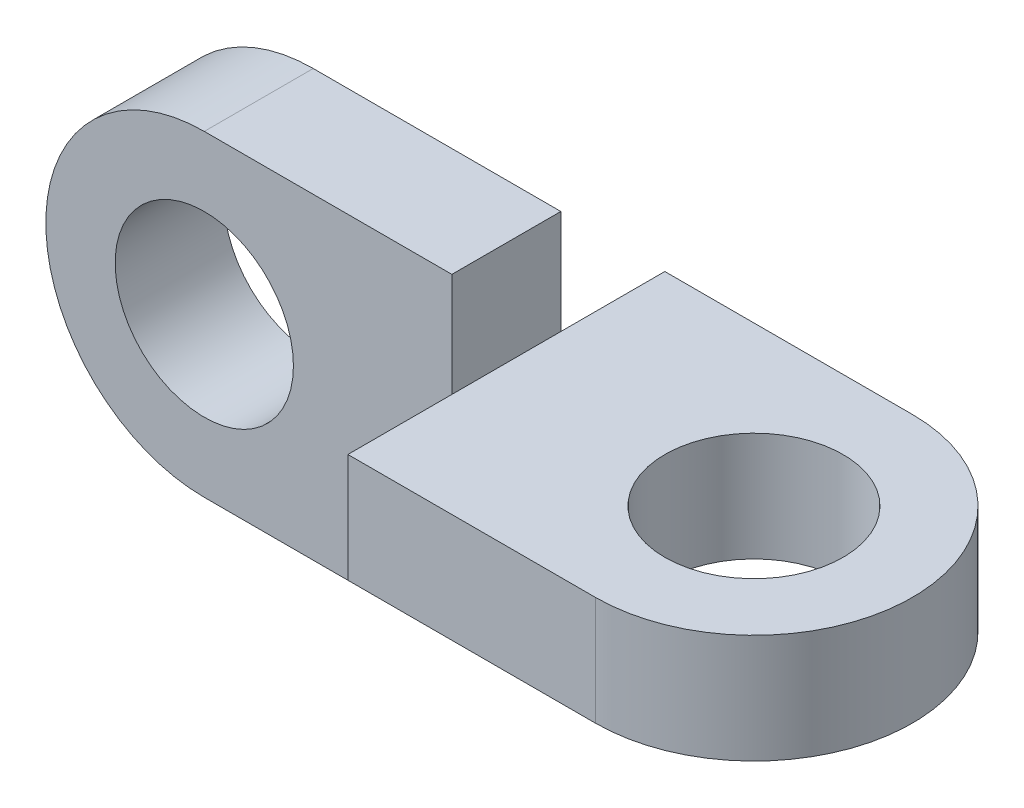
ISO-10303-21;
HEADER;
FILE_DESCRIPTION(('STEP AP214'),'2;1');
FILE_NAME('part.step','',(''),(''),'','','');
FILE_SCHEMA(('AUTOMOTIVE_DESIGN { 1 0 10303 214 1 1 1 1 }'));
ENDSEC;
DATA;
#1=APPLICATION_CONTEXT('core data for automotive mechanical design processes');
#2=APPLICATION_PROTOCOL_DEFINITION('international standard','automotive_design',2000,#1);
#3=PRODUCT_CONTEXT('',#1,'mechanical');
#4=PRODUCT('Part','Part','',(#3));
#5=PRODUCT_RELATED_PRODUCT_CATEGORY('part','',(#4));
#6=PRODUCT_DEFINITION_FORMATION('','',#4);
#7=PRODUCT_DEFINITION_CONTEXT('part definition',#1,'design');
#8=PRODUCT_DEFINITION('design','',#6,#7);
#9=PRODUCT_DEFINITION_SHAPE('','',#8);
#10=(LENGTH_UNIT() NAMED_UNIT(*) SI_UNIT(.MILLI.,.METRE.));
#11=(NAMED_UNIT(*) PLANE_ANGLE_UNIT() SI_UNIT($,.RADIAN.));
#12=(NAMED_UNIT(*) SI_UNIT($,.STERADIAN.) SOLID_ANGLE_UNIT());
#13=UNCERTAINTY_MEASURE_WITH_UNIT(LENGTH_MEASURE(1.E-05),#10,'distance_accuracy_value','');
#14=(GEOMETRIC_REPRESENTATION_CONTEXT(3) GLOBAL_UNCERTAINTY_ASSIGNED_CONTEXT((#13)) GLOBAL_UNIT_ASSIGNED_CONTEXT((#10,
#11,#12)) REPRESENTATION_CONTEXT('',''));
#15=CARTESIAN_POINT('',(0.,0.,0.));
#16=DIRECTION('',(0.,0.,1.));
#17=DIRECTION('',(1.,0.,0.));
#18=AXIS2_PLACEMENT_3D('',#15,#16,#17);
#19=CARTESIAN_POINT('',(50.,32.,11.));
#20=DIRECTION('',(-1.,0.,0.));
#21=DIRECTION('',(0.,0.,1.));
#22=AXIS2_PLACEMENT_3D('',#19,#20,#21);
#23=PLANE('',#22);
#24=DIRECTION('',(0.,0.,1.));
#25=VECTOR('',#24,1.);
#26=CARTESIAN_POINT('',(50.,11.,32.0000000000001));
#27=LINE('',#26,#25);
#28=CARTESIAN_POINT('',(50.,11.,-11.));
#29=VERTEX_POINT('',#28);
#30=CARTESIAN_POINT('',(50.,11.,11.));
#31=VERTEX_POINT('',#30);
#32=EDGE_CURVE('E48',#29,#31,#27,.T.);
#33=ORIENTED_EDGE('',*,*,#32,.F.);
#34=DIRECTION('',(0.,1.,0.));
#35=VECTOR('',#34,1.);
#36=CARTESIAN_POINT('',(50.,32.,-11.));
#37=LINE('',#36,#35);
#38=CARTESIAN_POINT('',(50.,32.,-11.));
#39=VERTEX_POINT('',#38);
#40=EDGE_CURVE('E176',#29,#39,#37,.T.);
#41=ORIENTED_EDGE('',*,*,#40,.T.);
#42=DIRECTION('',(0.,0.,-1.));
#43=VECTOR('',#42,1.);
#44=CARTESIAN_POINT('',(50.,32.,11.));
#45=LINE('',#44,#43);
#46=CARTESIAN_POINT('',(50.,32.,11.));
#47=VERTEX_POINT('',#46);
#48=EDGE_CURVE('E183',#47,#39,#45,.T.);
#49=ORIENTED_EDGE('',*,*,#48,.F.);
#50=DIRECTION('',(0.,1.,0.));
#51=VECTOR('',#50,1.);
#52=CARTESIAN_POINT('',(50.,32.,11.));
#53=LINE('',#52,#51);
#54=EDGE_CURVE('E164',#31,#47,#53,.T.);
#55=ORIENTED_EDGE('',*,*,#54,.F.);
#56=EDGE_LOOP('',(#33,#41,#49,#55));
#57=FACE_BOUND('',#56,.T.);
#58=ADVANCED_FACE('F39',(#57),#23,.F.);
#59=CARTESIAN_POINT('',(0.,0.,11.));
#60=DIRECTION('',(0.,0.,1.));
#61=DIRECTION('',(1.,0.,0.));
#62=AXIS2_PLACEMENT_3D('',#59,#60,#61);
#63=PLANE('',#62);
#64=CARTESIAN_POINT('',(0.,0.,11.));
#65=DIRECTION('',(0.,0.,1.));
#66=DIRECTION('',(1.,0.,0.));
#67=AXIS2_PLACEMENT_3D('',#64,#65,#66);
#68=CIRCLE('',#67,32.);
#69=CARTESIAN_POINT('',(0.,32.,11.));
#70=VERTEX_POINT('',#69);
#71=CARTESIAN_POINT('',(0.,-32.,11.));
#72=VERTEX_POINT('',#71);
#73=EDGE_CURVE('E159',#70,#72,#68,.T.);
#74=ORIENTED_EDGE('',*,*,#73,.T.);
#75=DIRECTION('',(1.,0.,0.));
#76=VECTOR('',#75,1.);
#77=CARTESIAN_POINT('',(50.,-32.,11.));
#78=LINE('',#77,#76);
#79=CARTESIAN_POINT('',(50.,-32.,11.));
#80=VERTEX_POINT('',#79);
#81=EDGE_CURVE('E165',#72,#80,#78,.T.);
#82=ORIENTED_EDGE('',*,*,#81,.T.);
#83=CARTESIAN_POINT('',(50.,-11.,11.));
#84=VERTEX_POINT('',#83);
#85=EDGE_CURVE('E168',#80,#84,#53,.T.);
#86=ORIENTED_EDGE('',*,*,#85,.T.);
#87=EDGE_CURVE('E170',#84,#31,#53,.T.);
#88=ORIENTED_EDGE('',*,*,#87,.T.);
#89=ORIENTED_EDGE('',*,*,#54,.T.);
#90=DIRECTION('',(-1.,0.,0.));
#91=VECTOR('',#90,1.);
#92=CARTESIAN_POINT('',(0.,32.,11.));
#93=LINE('',#92,#91);
#94=EDGE_CURVE('E166',#47,#70,#93,.T.);
#95=ORIENTED_EDGE('',*,*,#94,.T.);
#96=EDGE_LOOP('',(#74,#82,#86,#88,#89,#95));
#97=FACE_BOUND('',#96,.T.);
#98=CARTESIAN_POINT('',(0.,0.,11.));
#99=DIRECTION('',(0.,0.,1.));
#100=DIRECTION('',(1.,0.,0.));
#101=AXIS2_PLACEMENT_3D('',#98,#99,#100);
#102=CIRCLE('',#101,18.);
#103=CARTESIAN_POINT('',(18.,0.,11.));
#104=VERTEX_POINT('',#103);
#105=EDGE_CURVE('E148',#104,#104,#102,.T.);
#106=ORIENTED_EDGE('',*,*,#105,.F.);
#107=EDGE_LOOP('',(#106));
#108=FACE_BOUND('',#107,.T.);
#109=ADVANCED_FACE('F232',(#97,#108),#63,.T.);
#110=CARTESIAN_POINT('',(0.,0.,-11.));
#111=DIRECTION('',(0.,0.,1.));
#112=DIRECTION('',(1.,0.,0.));
#113=AXIS2_PLACEMENT_3D('',#110,#111,#112);
#114=PLANE('',#113);
#115=CARTESIAN_POINT('',(0.,0.,-11.));
#116=DIRECTION('',(0.,0.,1.));
#117=DIRECTION('',(1.,0.,0.));
#118=AXIS2_PLACEMENT_3D('',#115,#116,#117);
#119=CIRCLE('',#118,32.);
#120=CARTESIAN_POINT('',(0.,32.,-11.));
#121=VERTEX_POINT('',#120);
#122=CARTESIAN_POINT('',(0.,-32.,-11.));
#123=VERTEX_POINT('',#122);
#124=EDGE_CURVE('E160',#121,#123,#119,.T.);
#125=ORIENTED_EDGE('',*,*,#124,.F.);
#126=DIRECTION('',(-1.,0.,0.));
#127=VECTOR('',#126,1.);
#128=CARTESIAN_POINT('',(0.,32.,-11.));
#129=LINE('',#128,#127);
#130=EDGE_CURVE('E161',#39,#121,#129,.T.);
#131=ORIENTED_EDGE('',*,*,#130,.F.);
#132=ORIENTED_EDGE('',*,*,#40,.F.);
#133=CARTESIAN_POINT('',(50.,-11.,-11.));
#134=VERTEX_POINT('',#133);
#135=EDGE_CURVE('E177',#134,#29,#37,.T.);
#136=ORIENTED_EDGE('',*,*,#135,.F.);
#137=CARTESIAN_POINT('',(50.,-32.,-11.));
#138=VERTEX_POINT('',#137);
#139=EDGE_CURVE('E180',#138,#134,#37,.T.);
#140=ORIENTED_EDGE('',*,*,#139,.F.);
#141=DIRECTION('',(1.,0.,0.));
#142=VECTOR('',#141,1.);
#143=CARTESIAN_POINT('',(50.,-32.,-11.));
#144=LINE('',#143,#142);
#145=EDGE_CURVE('E174',#123,#138,#144,.T.);
#146=ORIENTED_EDGE('',*,*,#145,.F.);
#147=EDGE_LOOP('',(#125,#131,#132,#136,#140,#146));
#148=FACE_BOUND('',#147,.T.);
#149=CARTESIAN_POINT('',(0.,0.,-11.));
#150=DIRECTION('',(0.,0.,1.));
#151=DIRECTION('',(1.,0.,0.));
#152=AXIS2_PLACEMENT_3D('',#149,#150,#151);
#153=CIRCLE('',#152,18.);
#154=CARTESIAN_POINT('',(18.,0.,-11.));
#155=VERTEX_POINT('',#154);
#156=EDGE_CURVE('E150',#155,#155,#153,.T.);
#157=ORIENTED_EDGE('',*,*,#156,.T.);
#158=EDGE_LOOP('',(#157));
#159=FACE_BOUND('',#158,.T.);
#160=ADVANCED_FACE('F228',(#148,#159),#114,.F.);
#161=CARTESIAN_POINT('',(0.,0.,11.));
#162=DIRECTION('',(0.,0.,-1.));
#163=DIRECTION('',(-1.,0.,0.));
#164=AXIS2_PLACEMENT_3D('',#161,#162,#163);
#165=CYLINDRICAL_SURFACE('',#164,32.);
#166=ORIENTED_EDGE('',*,*,#124,.T.);
#167=DIRECTION('',(0.,0.,-1.));
#168=VECTOR('',#167,1.);
#169=CARTESIAN_POINT('',(0.,-32.,11.));
#170=LINE('',#169,#168);
#171=EDGE_CURVE('E43',#72,#123,#170,.T.);
#172=ORIENTED_EDGE('',*,*,#171,.F.);
#173=ORIENTED_EDGE('',*,*,#73,.F.);
#174=DIRECTION('',(0.,0.,-1.));
#175=VECTOR('',#174,1.);
#176=CARTESIAN_POINT('',(0.,32.,11.));
#177=LINE('',#176,#175);
#178=EDGE_CURVE('E173',#70,#121,#177,.T.);
#179=ORIENTED_EDGE('',*,*,#178,.T.);
#180=EDGE_LOOP('',(#166,#172,#173,#179));
#181=FACE_BOUND('',#180,.T.);
#182=ADVANCED_FACE('F41',(#181),#165,.T.);
#183=CARTESIAN_POINT('',(50.,-32.,11.));
#184=DIRECTION('',(0.,1.,0.));
#185=DIRECTION('',(0.,0.,1.));
#186=AXIS2_PLACEMENT_3D('',#183,#184,#185);
#187=PLANE('',#186);
#188=ORIENTED_EDGE('',*,*,#145,.T.);
#189=DIRECTION('',(0.,0.,-1.));
#190=VECTOR('',#189,1.);
#191=CARTESIAN_POINT('',(50.,-32.,11.));
#192=LINE('',#191,#190);
#193=EDGE_CURVE('E184',#80,#138,#192,.T.);
#194=ORIENTED_EDGE('',*,*,#193,.F.);
#195=ORIENTED_EDGE('',*,*,#81,.F.);
#196=ORIENTED_EDGE('',*,*,#171,.T.);
#197=EDGE_LOOP('',(#188,#194,#195,#196));
#198=FACE_BOUND('',#197,.T.);
#199=ADVANCED_FACE('F240',(#198),#187,.F.);
#200=ORIENTED_EDGE('',*,*,#139,.T.);
#201=DIRECTION('',(0.,0.,1.));
#202=VECTOR('',#201,1.);
#203=CARTESIAN_POINT('',(50.,-11.,32.0000000000001));
#204=LINE('',#203,#202);
#205=EDGE_CURVE('E11',#134,#84,#204,.T.);
#206=ORIENTED_EDGE('',*,*,#205,.T.);
#207=ORIENTED_EDGE('',*,*,#85,.F.);
#208=ORIENTED_EDGE('',*,*,#193,.T.);
#209=EDGE_LOOP('',(#200,#206,#207,#208));
#210=FACE_BOUND('',#209,.T.);
#211=ADVANCED_FACE('F234',(#210),#23,.F.);
#212=CARTESIAN_POINT('',(0.,32.,11.));
#213=DIRECTION('',(0.,-1.,0.));
#214=DIRECTION('',(0.,0.,-1.));
#215=AXIS2_PLACEMENT_3D('',#212,#213,#214);
#216=PLANE('',#215);
#217=ORIENTED_EDGE('',*,*,#130,.T.);
#218=ORIENTED_EDGE('',*,*,#178,.F.);
#219=ORIENTED_EDGE('',*,*,#94,.F.);
#220=ORIENTED_EDGE('',*,*,#48,.T.);
#221=EDGE_LOOP('',(#217,#218,#219,#220));
#222=FACE_BOUND('',#221,.T.);
#223=ADVANCED_FACE('F224',(#222),#216,.F.);
#224=CARTESIAN_POINT('',(0.,0.,11.));
#225=DIRECTION('',(0.,0.,-1.));
#226=DIRECTION('',(-1.,0.,0.));
#227=AXIS2_PLACEMENT_3D('',#224,#225,#226);
#228=CYLINDRICAL_SURFACE('',#227,18.);
#229=ORIENTED_EDGE('',*,*,#105,.T.);
#230=EDGE_LOOP('',(#229));
#231=FACE_BOUND('',#230,.T.);
#232=ORIENTED_EDGE('',*,*,#156,.F.);
#233=EDGE_LOOP('',(#232));
#234=FACE_BOUND('',#233,.T.);
#235=ADVANCED_FACE('F242',(#231,#234),#228,.F.);
#236=CARTESIAN_POINT('',(50.,11.,32.0000000000001));
#237=DIRECTION('',(1.,0.,0.));
#238=DIRECTION('',(0.,0.,-1.));
#239=AXIS2_PLACEMENT_3D('',#236,#237,#238);
#240=PLANE('',#239);
#241=CARTESIAN_POINT('',(50.,-11.,-32.));
#242=VERTEX_POINT('',#241);
#243=EDGE_CURVE('E49',#242,#134,#204,.T.);
#244=ORIENTED_EDGE('',*,*,#243,.T.);
#245=ORIENTED_EDGE('',*,*,#135,.T.);
#246=CARTESIAN_POINT('',(50.,11.,-32.));
#247=VERTEX_POINT('',#246);
#248=EDGE_CURVE('E194',#247,#29,#27,.T.);
#249=ORIENTED_EDGE('',*,*,#248,.F.);
#250=DIRECTION('',(0.,-1.,0.));
#251=VECTOR('',#250,1.);
#252=CARTESIAN_POINT('',(50.,11.,-32.));
#253=LINE('',#252,#251);
#254=EDGE_CURVE('E130',#247,#242,#253,.T.);
#255=ORIENTED_EDGE('',*,*,#254,.T.);
#256=EDGE_LOOP('',(#244,#245,#249,#255));
#257=FACE_BOUND('',#256,.T.);
#258=ADVANCED_FACE('F216',(#257),#240,.F.);
#259=CARTESIAN_POINT('',(100.,11.,0.));
#260=DIRECTION('',(0.,1.,0.));
#261=DIRECTION('',(0.,0.,1.));
#262=AXIS2_PLACEMENT_3D('',#259,#260,#261);
#263=PLANE('',#262);
#264=CARTESIAN_POINT('',(100.,11.,0.));
#265=DIRECTION('',(0.,1.,0.));
#266=DIRECTION('',(0.,0.,1.));
#267=AXIS2_PLACEMENT_3D('',#264,#265,#266);
#268=CIRCLE('',#267,32.);
#269=CARTESIAN_POINT('',(100.,11.,32.0000000000001));
#270=VERTEX_POINT('',#269);
#271=CARTESIAN_POINT('',(100.,11.,-32.));
#272=VERTEX_POINT('',#271);
#273=EDGE_CURVE('E135',#270,#272,#268,.T.);
#274=ORIENTED_EDGE('',*,*,#273,.T.);
#275=DIRECTION('',(-1.,0.,0.));
#276=VECTOR('',#275,1.);
#277=CARTESIAN_POINT('',(50.,11.,-32.));
#278=LINE('',#277,#276);
#279=EDGE_CURVE('E119',#272,#247,#278,.T.);
#280=ORIENTED_EDGE('',*,*,#279,.T.);
#281=ORIENTED_EDGE('',*,*,#248,.T.);
#282=ORIENTED_EDGE('',*,*,#32,.T.);
#283=CARTESIAN_POINT('',(50.,11.,32.0000000000001));
#284=VERTEX_POINT('',#283);
#285=EDGE_CURVE('E131',#31,#284,#27,.T.);
#286=ORIENTED_EDGE('',*,*,#285,.T.);
#287=DIRECTION('',(1.,0.,0.));
#288=VECTOR('',#287,1.);
#289=CARTESIAN_POINT('',(100.,11.,32.0000000000001));
#290=LINE('',#289,#288);
#291=EDGE_CURVE('E138',#284,#270,#290,.T.);
#292=ORIENTED_EDGE('',*,*,#291,.T.);
#293=EDGE_LOOP('',(#274,#280,#281,#282,#286,#292));
#294=FACE_BOUND('',#293,.T.);
#295=CARTESIAN_POINT('',(100.,11.,0.));
#296=DIRECTION('',(0.,1.,0.));
#297=DIRECTION('',(0.,0.,1.));
#298=AXIS2_PLACEMENT_3D('',#295,#296,#297);
#299=CIRCLE('',#298,18.);
#300=CARTESIAN_POINT('',(100.,11.,18.));
#301=VERTEX_POINT('',#300);
#302=EDGE_CURVE('E209',#301,#301,#299,.T.);
#303=ORIENTED_EDGE('',*,*,#302,.F.);
#304=EDGE_LOOP('',(#303));
#305=FACE_BOUND('',#304,.T.);
#306=ADVANCED_FACE('F134',(#294,#305),#263,.T.);
#307=CARTESIAN_POINT('',(100.,-11.,0.));
#308=DIRECTION('',(0.,1.,0.));
#309=DIRECTION('',(0.,0.,1.));
#310=AXIS2_PLACEMENT_3D('',#307,#308,#309);
#311=PLANE('',#310);
#312=CARTESIAN_POINT('',(100.,-11.,0.));
#313=DIRECTION('',(0.,1.,0.));
#314=DIRECTION('',(0.,0.,1.));
#315=AXIS2_PLACEMENT_3D('',#312,#313,#314);
#316=CIRCLE('',#315,32.);
#317=CARTESIAN_POINT('',(100.,-11.,32.0000000000001));
#318=VERTEX_POINT('',#317);
#319=CARTESIAN_POINT('',(100.,-11.,-32.));
#320=VERTEX_POINT('',#319);
#321=EDGE_CURVE('E147',#318,#320,#316,.T.);
#322=ORIENTED_EDGE('',*,*,#321,.F.);
#323=DIRECTION('',(1.,0.,0.));
#324=VECTOR('',#323,1.);
#325=CARTESIAN_POINT('',(100.,-11.,32.0000000000001));
#326=LINE('',#325,#324);
#327=CARTESIAN_POINT('',(50.,-11.,32.0000000000001));
#328=VERTEX_POINT('',#327);
#329=EDGE_CURVE('E145',#328,#318,#326,.T.);
#330=ORIENTED_EDGE('',*,*,#329,.F.);
#331=EDGE_CURVE('E51',#84,#328,#204,.T.);
#332=ORIENTED_EDGE('',*,*,#331,.F.);
#333=ORIENTED_EDGE('',*,*,#205,.F.);
#334=ORIENTED_EDGE('',*,*,#243,.F.);
#335=DIRECTION('',(-1.,0.,0.));
#336=VECTOR('',#335,1.);
#337=CARTESIAN_POINT('',(50.,-11.,-32.));
#338=LINE('',#337,#336);
#339=EDGE_CURVE('E207',#320,#242,#338,.T.);
#340=ORIENTED_EDGE('',*,*,#339,.F.);
#341=EDGE_LOOP('',(#322,#330,#332,#333,#334,#340));
#342=FACE_BOUND('',#341,.T.);
#343=CARTESIAN_POINT('',(100.,-11.,0.));
#344=DIRECTION('',(0.,1.,0.));
#345=DIRECTION('',(0.,0.,1.));
#346=AXIS2_PLACEMENT_3D('',#343,#344,#345);
#347=CIRCLE('',#346,18.);
#348=CARTESIAN_POINT('',(100.,-11.,18.));
#349=VERTEX_POINT('',#348);
#350=EDGE_CURVE('E282',#349,#349,#347,.T.);
#351=ORIENTED_EDGE('',*,*,#350,.T.);
#352=EDGE_LOOP('',(#351));
#353=FACE_BOUND('',#352,.T.);
#354=ADVANCED_FACE('F215',(#342,#353),#311,.F.);
#355=CARTESIAN_POINT('',(100.,11.,0.));
#356=DIRECTION('',(0.,-1.,0.));
#357=DIRECTION('',(0.,0.,-1.));
#358=AXIS2_PLACEMENT_3D('',#355,#356,#357);
#359=CYLINDRICAL_SURFACE('',#358,32.);
#360=ORIENTED_EDGE('',*,*,#321,.T.);
#361=DIRECTION('',(0.,-1.,0.));
#362=VECTOR('',#361,1.);
#363=CARTESIAN_POINT('',(100.,11.,-32.));
#364=LINE('',#363,#362);
#365=EDGE_CURVE('E125',#272,#320,#364,.T.);
#366=ORIENTED_EDGE('',*,*,#365,.F.);
#367=ORIENTED_EDGE('',*,*,#273,.F.);
#368=DIRECTION('',(0.,-1.,0.));
#369=VECTOR('',#368,1.);
#370=CARTESIAN_POINT('',(100.,11.,32.0000000000001));
#371=LINE('',#370,#369);
#372=EDGE_CURVE('E204',#270,#318,#371,.T.);
#373=ORIENTED_EDGE('',*,*,#372,.T.);
#374=EDGE_LOOP('',(#360,#366,#367,#373));
#375=FACE_BOUND('',#374,.T.);
#376=ADVANCED_FACE('F143',(#375),#359,.T.);
#377=CARTESIAN_POINT('',(50.,11.,-32.));
#378=DIRECTION('',(0.,0.,1.));
#379=DIRECTION('',(1.,0.,0.));
#380=AXIS2_PLACEMENT_3D('',#377,#378,#379);
#381=PLANE('',#380);
#382=ORIENTED_EDGE('',*,*,#339,.T.);
#383=ORIENTED_EDGE('',*,*,#254,.F.);
#384=ORIENTED_EDGE('',*,*,#279,.F.);
#385=ORIENTED_EDGE('',*,*,#365,.T.);
#386=EDGE_LOOP('',(#382,#383,#384,#385));
#387=FACE_BOUND('',#386,.T.);
#388=ADVANCED_FACE('F122',(#387),#381,.F.);
#389=ORIENTED_EDGE('',*,*,#87,.F.);
#390=ORIENTED_EDGE('',*,*,#331,.T.);
#391=DIRECTION('',(0.,-1.,0.));
#392=VECTOR('',#391,1.);
#393=CARTESIAN_POINT('',(50.,11.,32.0000000000001));
#394=LINE('',#393,#392);
#395=EDGE_CURVE('E155',#284,#328,#394,.T.);
#396=ORIENTED_EDGE('',*,*,#395,.F.);
#397=ORIENTED_EDGE('',*,*,#285,.F.);
#398=EDGE_LOOP('',(#389,#390,#396,#397));
#399=FACE_BOUND('',#398,.T.);
#400=ADVANCED_FACE('F199',(#399),#240,.F.);
#401=CARTESIAN_POINT('',(100.,11.,32.0000000000001));
#402=DIRECTION('',(0.,0.,-1.));
#403=DIRECTION('',(-1.,0.,0.));
#404=AXIS2_PLACEMENT_3D('',#401,#402,#403);
#405=PLANE('',#404);
#406=ORIENTED_EDGE('',*,*,#329,.T.);
#407=ORIENTED_EDGE('',*,*,#372,.F.);
#408=ORIENTED_EDGE('',*,*,#291,.F.);
#409=ORIENTED_EDGE('',*,*,#395,.T.);
#410=EDGE_LOOP('',(#406,#407,#408,#409));
#411=FACE_BOUND('',#410,.T.);
#412=ADVANCED_FACE('F203',(#411),#405,.F.);
#413=CARTESIAN_POINT('',(100.,11.,0.));
#414=DIRECTION('',(0.,-1.,0.));
#415=DIRECTION('',(0.,0.,-1.));
#416=AXIS2_PLACEMENT_3D('',#413,#414,#415);
#417=CYLINDRICAL_SURFACE('',#416,18.);
#418=ORIENTED_EDGE('',*,*,#302,.T.);
#419=EDGE_LOOP('',(#418));
#420=FACE_BOUND('',#419,.T.);
#421=ORIENTED_EDGE('',*,*,#350,.F.);
#422=EDGE_LOOP('',(#421));
#423=FACE_BOUND('',#422,.T.);
#424=ADVANCED_FACE('F270',(#420,#423),#417,.F.);
#425=CLOSED_SHELL('',(#58,#109,#160,#182,#199,#211,#223,#235,#258,#306,#354,#376,#388,#400,#412,#424));
#426=MANIFOLD_SOLID_BREP('B2',#425);
#427=ADVANCED_BREP_SHAPE_REPRESENTATION('',(#18,#426),#14);
#428=SHAPE_DEFINITION_REPRESENTATION(#9,#427);
ENDSEC;
END-ISO-10303-21;
